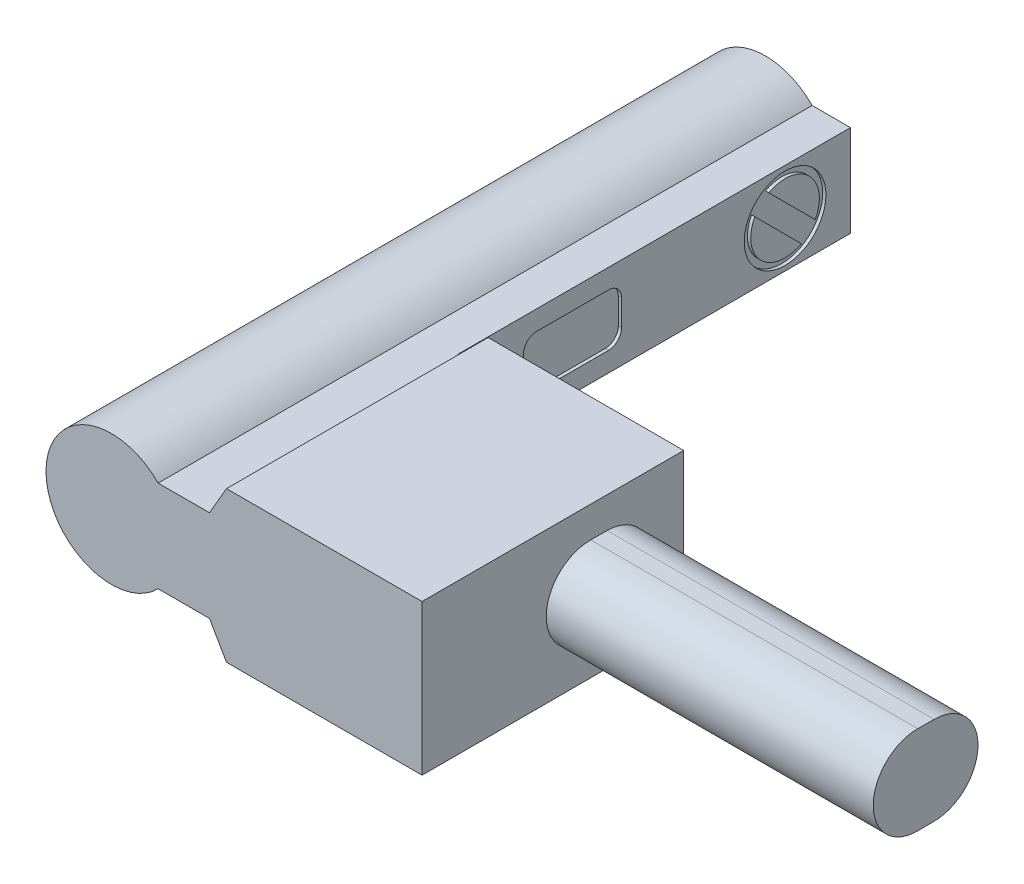
ISO-10303-21;
HEADER;
FILE_DESCRIPTION(('STEP AP214'),'2;1');
FILE_NAME('part.step','',(''),(''),'','','');
FILE_SCHEMA(('AUTOMOTIVE_DESIGN { 1 0 10303 214 1 1 1 1 }'));
ENDSEC;
DATA;
#1=APPLICATION_CONTEXT('core data for automotive mechanical design processes');
#2=APPLICATION_PROTOCOL_DEFINITION('international standard','automotive_design',2000,#1);
#3=PRODUCT_CONTEXT('',#1,'mechanical');
#4=PRODUCT('Part','Part','',(#3));
#5=PRODUCT_RELATED_PRODUCT_CATEGORY('part','',(#4));
#6=PRODUCT_DEFINITION_FORMATION('','',#4);
#7=PRODUCT_DEFINITION_CONTEXT('part definition',#1,'design');
#8=PRODUCT_DEFINITION('design','',#6,#7);
#9=PRODUCT_DEFINITION_SHAPE('','',#8);
#10=(LENGTH_UNIT() NAMED_UNIT(*) SI_UNIT(.MILLI.,.METRE.));
#11=(NAMED_UNIT(*) PLANE_ANGLE_UNIT() SI_UNIT($,.RADIAN.));
#12=(NAMED_UNIT(*) SI_UNIT($,.STERADIAN.) SOLID_ANGLE_UNIT());
#13=UNCERTAINTY_MEASURE_WITH_UNIT(LENGTH_MEASURE(1.E-05),#10,'distance_accuracy_value','');
#14=(GEOMETRIC_REPRESENTATION_CONTEXT(3) GLOBAL_UNCERTAINTY_ASSIGNED_CONTEXT((#13)) GLOBAL_UNIT_ASSIGNED_CONTEXT((#10,
#11,#12)) REPRESENTATION_CONTEXT('',''));
#15=CARTESIAN_POINT('',(0.,0.,0.));
#16=DIRECTION('',(0.,0.,1.));
#17=DIRECTION('',(1.,0.,0.));
#18=AXIS2_PLACEMENT_3D('',#15,#16,#17);
#19=CARTESIAN_POINT('',(56.6,45.4,143.));
#20=DIRECTION('',(1.,0.,0.));
#21=DIRECTION('',(0.,0.,-1.));
#22=AXIS2_PLACEMENT_3D('',#19,#20,#21);
#23=PLANE('',#22);
#24=CARTESIAN_POINT('',(56.6,44.,145.));
#25=DIRECTION('',(1.,0.,0.));
#26=DIRECTION('',(0.,0.,-1.));
#27=AXIS2_PLACEMENT_3D('',#24,#25,#26);
#28=CIRCLE('',#27,1.05);
#29=CARTESIAN_POINT('',(56.6,44.923644507894,145.499380439182));
#30=VERTEX_POINT('',#29);
#31=CARTESIAN_POINT('',(56.6,43.5006195608182,144.076355492106));
#32=VERTEX_POINT('',#31);
#33=EDGE_CURVE('E20',#30,#32,#28,.F.);
#34=ORIENTED_EDGE('',*,*,#33,.F.);
#35=DIRECTION('',(0.,0.707106781186548,0.707106781186548));
#36=VECTOR('',#35,1.);
#37=CARTESIAN_POINT('',(56.6,43.3905481980982,143.966284129386));
#38=LINE('',#37,#36);
#39=EDGE_CURVE('E150',#30,#32,#38,.F.);
#40=ORIENTED_EDGE('',*,*,#39,.T.);
#41=EDGE_LOOP('',(#34,#40));
#42=FACE_BOUND('',#41,.T.);
#43=ADVANCED_FACE('F17',(#42),#23,.T.);
#44=CARTESIAN_POINT('',(56.6,45.4,143.));
#45=DIRECTION('',(1.,0.,0.));
#46=DIRECTION('',(0.,0.,-1.));
#47=AXIS2_PLACEMENT_3D('',#44,#45,#46);
#48=PLANE('',#47);
#49=DIRECTION('',(0.,-0.707106781186548,-0.707106781186548));
#50=VECTOR('',#49,1.);
#51=CARTESIAN_POINT('',(56.6,44.6094518019018,146.033715870614));
#52=LINE('',#51,#50);
#53=CARTESIAN_POINT('',(56.6,43.0763554921061,144.500619560818));
#54=VERTEX_POINT('',#53);
#55=CARTESIAN_POINT('',(56.6,44.4993804391818,145.923644507894));
#56=VERTEX_POINT('',#55);
#57=EDGE_CURVE('E161',#54,#56,#52,.F.);
#58=ORIENTED_EDGE('',*,*,#57,.T.);
#59=CARTESIAN_POINT('',(56.6,44.,145.));
#60=DIRECTION('',(1.,0.,0.));
#61=DIRECTION('',(0.,0.,-1.));
#62=AXIS2_PLACEMENT_3D('',#59,#60,#61);
#63=CIRCLE('',#62,1.05);
#64=EDGE_CURVE('E236',#54,#56,#63,.F.);
#65=ORIENTED_EDGE('',*,*,#64,.F.);
#66=EDGE_LOOP('',(#58,#65));
#67=FACE_BOUND('',#66,.T.);
#68=ADVANCED_FACE('F765',(#67),#48,.T.);
#69=CARTESIAN_POINT('',(56.6,44.,145.));
#70=DIRECTION('',(1.,0.,0.));
#71=DIRECTION('',(0.,0.,-1.));
#72=AXIS2_PLACEMENT_3D('',#69,#70,#71);
#73=CYLINDRICAL_SURFACE('',#72,1.05);
#74=DIRECTION('',(1.,0.,0.));
#75=VECTOR('',#74,1.);
#76=CARTESIAN_POINT('',(56.6,43.5006195608181,144.076355492106));
#77=LINE('',#76,#75);
#78=CARTESIAN_POINT('',(56.5,43.5006195608181,144.076355492106));
#79=VERTEX_POINT('',#78);
#80=EDGE_CURVE('E162',#32,#79,#77,.F.);
#81=ORIENTED_EDGE('',*,*,#80,.T.);
#82=CARTESIAN_POINT('',(56.5,44.,145.));
#83=DIRECTION('',(1.,0.,0.));
#84=DIRECTION('',(0.,0.,-1.));
#85=AXIS2_PLACEMENT_3D('',#82,#83,#84);
#86=CIRCLE('',#85,1.05);
#87=CARTESIAN_POINT('',(56.5,44.9236445078939,145.499380439182));
#88=VERTEX_POINT('',#87);
#89=EDGE_CURVE('E157',#88,#79,#86,.F.);
#90=ORIENTED_EDGE('',*,*,#89,.F.);
#91=DIRECTION('',(1.,0.,0.));
#92=VECTOR('',#91,1.);
#93=CARTESIAN_POINT('',(56.6,44.923644507894,145.499380439182));
#94=LINE('',#93,#92);
#95=EDGE_CURVE('E154',#88,#30,#94,.T.);
#96=ORIENTED_EDGE('',*,*,#95,.T.);
#97=ORIENTED_EDGE('',*,*,#33,.T.);
#98=EDGE_LOOP('',(#81,#90,#96,#97));
#99=FACE_BOUND('',#98,.T.);
#100=ADVANCED_FACE('F155',(#99),#73,.T.);
#101=CARTESIAN_POINT('',(56.6,43.3905481980982,143.966284129386));
#102=DIRECTION('',(0.,0.707106781186548,-0.707106781186548));
#103=DIRECTION('',(0.,0.707106781186548,0.707106781186548));
#104=AXIS2_PLACEMENT_3D('',#101,#102,#103);
#105=PLANE('',#104);
#106=DIRECTION('',(0.,0.707106781186465,0.70710678118663));
#107=VECTOR('',#106,1.);
#108=CARTESIAN_POINT('',(56.5,43.5006195608181,144.076355492106));
#109=LINE('',#108,#107);
#110=EDGE_CURVE('E229',#79,#88,#109,.T.);
#111=ORIENTED_EDGE('',*,*,#110,.F.);
#112=ORIENTED_EDGE('',*,*,#80,.F.);
#113=ORIENTED_EDGE('',*,*,#39,.F.);
#114=ORIENTED_EDGE('',*,*,#95,.F.);
#115=EDGE_LOOP('',(#111,#112,#113,#114));
#116=FACE_BOUND('',#115,.T.);
#117=ADVANCED_FACE('F164',(#116),#105,.F.);
#118=CARTESIAN_POINT('',(56.6,44.6094518019018,146.033715870614));
#119=DIRECTION('',(0.,-0.707106781186548,0.707106781186548));
#120=DIRECTION('',(0.,-0.707106781186548,-0.707106781186548));
#121=AXIS2_PLACEMENT_3D('',#118,#119,#120);
#122=PLANE('',#121);
#123=ORIENTED_EDGE('',*,*,#57,.F.);
#124=DIRECTION('',(1.,0.,0.));
#125=VECTOR('',#124,1.);
#126=CARTESIAN_POINT('',(56.6,43.0763554921062,144.500619560818));
#127=LINE('',#126,#125);
#128=CARTESIAN_POINT('',(56.5,43.0763554921062,144.500619560818));
#129=VERTEX_POINT('',#128);
#130=EDGE_CURVE('E238',#129,#54,#127,.T.);
#131=ORIENTED_EDGE('',*,*,#130,.F.);
#132=DIRECTION('',(0.,-0.707106781186465,-0.70710678118663));
#133=VECTOR('',#132,1.);
#134=CARTESIAN_POINT('',(56.5,44.4993804391819,145.923644507894));
#135=LINE('',#134,#133);
#136=CARTESIAN_POINT('',(56.5,44.4993804391818,145.923644507894));
#137=VERTEX_POINT('',#136);
#138=EDGE_CURVE('E227',#137,#129,#135,.T.);
#139=ORIENTED_EDGE('',*,*,#138,.F.);
#140=DIRECTION('',(1.,0.,0.));
#141=VECTOR('',#140,1.);
#142=CARTESIAN_POINT('',(56.6,44.4993804391819,145.923644507894));
#143=LINE('',#142,#141);
#144=EDGE_CURVE('E235',#56,#137,#143,.F.);
#145=ORIENTED_EDGE('',*,*,#144,.F.);
#146=EDGE_LOOP('',(#123,#131,#139,#145));
#147=FACE_BOUND('',#146,.T.);
#148=ADVANCED_FACE('F742',(#147),#122,.F.);
#149=CARTESIAN_POINT('',(56.6,44.,145.));
#150=DIRECTION('',(1.,0.,0.));
#151=DIRECTION('',(0.,0.,-1.));
#152=AXIS2_PLACEMENT_3D('',#149,#150,#151);
#153=CYLINDRICAL_SURFACE('',#152,1.05);
#154=ORIENTED_EDGE('',*,*,#144,.T.);
#155=CARTESIAN_POINT('',(56.5,44.,145.));
#156=DIRECTION('',(1.,0.,0.));
#157=DIRECTION('',(0.,0.,-1.));
#158=AXIS2_PLACEMENT_3D('',#155,#156,#157);
#159=CIRCLE('',#158,1.05);
#160=EDGE_CURVE('E223',#129,#137,#159,.F.);
#161=ORIENTED_EDGE('',*,*,#160,.F.);
#162=ORIENTED_EDGE('',*,*,#130,.T.);
#163=ORIENTED_EDGE('',*,*,#64,.T.);
#164=EDGE_LOOP('',(#154,#161,#162,#163));
#165=FACE_BOUND('',#164,.T.);
#166=ADVANCED_FACE('F733',(#165),#153,.T.);
#167=CARTESIAN_POINT('',(56.5,44.,143.));
#168=DIRECTION('',(1.,0.,0.));
#169=DIRECTION('',(0.,0.,-1.));
#170=AXIS2_PLACEMENT_3D('',#167,#168,#169);
#171=PLANE('',#170);
#172=DIRECTION('',(0.,1.,0.));
#173=VECTOR('',#172,1.);
#174=CARTESIAN_POINT('',(56.5,43.6,150.));
#175=LINE('',#174,#173);
#176=CARTESIAN_POINT('',(56.5,43.6,150.));
#177=VERTEX_POINT('',#176);
#178=CARTESIAN_POINT('',(56.5,44.4,150.));
#179=VERTEX_POINT('',#178);
#180=EDGE_CURVE('E252',#177,#179,#175,.T.);
#181=ORIENTED_EDGE('',*,*,#180,.T.);
#182=CARTESIAN_POINT('',(56.5,44.4,150.4));
#183=DIRECTION('',(1.,0.,0.));
#184=DIRECTION('',(0.,0.,-1.));
#185=AXIS2_PLACEMENT_3D('',#182,#183,#184);
#186=CIRCLE('',#185,0.4);
#187=CARTESIAN_POINT('',(56.5,44.8,150.4));
#188=VERTEX_POINT('',#187);
#189=EDGE_CURVE('E218',#179,#188,#186,.T.);
#190=ORIENTED_EDGE('',*,*,#189,.T.);
#191=DIRECTION('',(0.,0.,1.));
#192=VECTOR('',#191,1.);
#193=CARTESIAN_POINT('',(56.5,44.8,150.4));
#194=LINE('',#193,#192);
#195=CARTESIAN_POINT('',(56.5,44.8,152.6));
#196=VERTEX_POINT('',#195);
#197=EDGE_CURVE('E261',#188,#196,#194,.T.);
#198=ORIENTED_EDGE('',*,*,#197,.T.);
#199=CARTESIAN_POINT('',(56.5,44.4,152.6));
#200=DIRECTION('',(1.,0.,0.));
#201=DIRECTION('',(0.,0.,-1.));
#202=AXIS2_PLACEMENT_3D('',#199,#200,#201);
#203=CIRCLE('',#202,0.4);
#204=CARTESIAN_POINT('',(56.5,44.4,153.));
#205=VERTEX_POINT('',#204);
#206=EDGE_CURVE('E233',#196,#205,#203,.T.);
#207=ORIENTED_EDGE('',*,*,#206,.T.);
#208=DIRECTION('',(0.,1.,0.));
#209=VECTOR('',#208,1.);
#210=CARTESIAN_POINT('',(56.5,44.,153.));
#211=LINE('',#210,#209);
#212=CARTESIAN_POINT('',(56.5,43.6,153.));
#213=VERTEX_POINT('',#212);
#214=EDGE_CURVE('E232',#205,#213,#211,.F.);
#215=ORIENTED_EDGE('',*,*,#214,.T.);
#216=CARTESIAN_POINT('',(56.5,43.6,152.6));
#217=DIRECTION('',(1.,0.,0.));
#218=DIRECTION('',(0.,0.,-1.));
#219=AXIS2_PLACEMENT_3D('',#216,#217,#218);
#220=CIRCLE('',#219,0.4);
#221=CARTESIAN_POINT('',(56.5,43.2,152.6));
#222=VERTEX_POINT('',#221);
#223=EDGE_CURVE('E230',#213,#222,#220,.T.);
#224=ORIENTED_EDGE('',*,*,#223,.T.);
#225=DIRECTION('',(0.,0.,-1.));
#226=VECTOR('',#225,1.);
#227=CARTESIAN_POINT('',(56.5,43.2,152.6));
#228=LINE('',#227,#226);
#229=CARTESIAN_POINT('',(56.5,43.2,150.4));
#230=VERTEX_POINT('',#229);
#231=EDGE_CURVE('E257',#222,#230,#228,.T.);
#232=ORIENTED_EDGE('',*,*,#231,.T.);
#233=CARTESIAN_POINT('',(56.5,43.6,150.4));
#234=DIRECTION('',(1.,0.,0.));
#235=DIRECTION('',(0.,0.,-1.));
#236=AXIS2_PLACEMENT_3D('',#233,#234,#235);
#237=CIRCLE('',#236,0.4);
#238=EDGE_CURVE('E213',#230,#177,#237,.T.);
#239=ORIENTED_EDGE('',*,*,#238,.T.);
#240=EDGE_LOOP('',(#181,#190,#198,#207,#215,#224,#232,#239));
#241=FACE_BOUND('',#240,.T.);
#242=ADVANCED_FACE('F724',(#241),#171,.T.);
#243=CARTESIAN_POINT('',(56.5,44.,143.));
#244=DIRECTION('',(1.,0.,0.));
#245=DIRECTION('',(0.,0.,-1.));
#246=AXIS2_PLACEMENT_3D('',#243,#244,#245);
#247=PLANE('',#246);
#248=CARTESIAN_POINT('',(56.5,44.,145.));
#249=DIRECTION('',(1.,0.,0.));
#250=DIRECTION('',(0.,0.,-1.));
#251=AXIS2_PLACEMENT_3D('',#248,#249,#250);
#252=CIRCLE('',#251,1.25);
#253=CARTESIAN_POINT('',(56.5,44.,143.75));
#254=VERTEX_POINT('',#253);
#255=EDGE_CURVE('E209',#254,#254,#252,.T.);
#256=ORIENTED_EDGE('',*,*,#255,.T.);
#257=EDGE_LOOP('',(#256));
#258=FACE_BOUND('',#257,.T.);
#259=ORIENTED_EDGE('',*,*,#138,.T.);
#260=ORIENTED_EDGE('',*,*,#160,.T.);
#261=EDGE_LOOP('',(#259,#260));
#262=FACE_BOUND('',#261,.T.);
#263=ORIENTED_EDGE('',*,*,#89,.T.);
#264=ORIENTED_EDGE('',*,*,#110,.T.);
#265=EDGE_LOOP('',(#263,#264));
#266=FACE_BOUND('',#265,.T.);
#267=ADVANCED_FACE('F715',(#258,#262,#266),#247,.T.);
#268=CARTESIAN_POINT('',(73.5,44.,143.));
#269=DIRECTION('',(1.,0.,0.));
#270=DIRECTION('',(0.,0.,-1.));
#271=AXIS2_PLACEMENT_3D('',#268,#269,#270);
#272=PLANE('',#271);
#273=CARTESIAN_POINT('',(73.5,44.,157.85));
#274=DIRECTION('',(-1.,0.,0.));
#275=DIRECTION('',(0.,0.,1.));
#276=AXIS2_PLACEMENT_3D('',#273,#274,#275);
#277=CIRCLE('',#276,1.353);
#278=CARTESIAN_POINT('',(73.5,42.6470243542192,157.841882));
#279=VERTEX_POINT('',#278);
#280=CARTESIAN_POINT('',(73.5,45.3529756457808,157.841882));
#281=VERTEX_POINT('',#280);
#282=EDGE_CURVE('E205',#279,#281,#277,.T.);
#283=ORIENTED_EDGE('',*,*,#282,.F.);
#284=DIRECTION('',(0.,0.00599999999999964,-0.999981999837997));
#285=VECTOR('',#284,1.);
#286=CARTESIAN_POINT('',(73.5,42.6500243002187,157.3419));
#287=LINE('',#286,#285);
#288=CARTESIAN_POINT('',(73.5,42.6500243002187,157.3419));
#289=VERTEX_POINT('',#288);
#290=EDGE_CURVE('E226',#289,#279,#287,.F.);
#291=ORIENTED_EDGE('',*,*,#290,.F.);
#292=CARTESIAN_POINT('',(73.5,44.,157.35));
#293=DIRECTION('',(-1.,0.,0.));
#294=DIRECTION('',(0.,0.,1.));
#295=AXIS2_PLACEMENT_3D('',#292,#293,#294);
#296=CIRCLE('',#295,1.35);
#297=CARTESIAN_POINT('',(73.5,45.3499756997813,157.3419));
#298=VERTEX_POINT('',#297);
#299=EDGE_CURVE('E200',#298,#289,#296,.T.);
#300=ORIENTED_EDGE('',*,*,#299,.F.);
#301=DIRECTION('',(0.,0.00599999999999964,0.999981999837997));
#302=VECTOR('',#301,1.);
#303=CARTESIAN_POINT('',(73.5,45.3529756457808,157.841882));
#304=LINE('',#303,#302);
#305=EDGE_CURVE('E278',#281,#298,#304,.F.);
#306=ORIENTED_EDGE('',*,*,#305,.F.);
#307=EDGE_LOOP('',(#283,#291,#300,#306));
#308=FACE_BOUND('',#307,.T.);
#309=ADVANCED_FACE('F706',(#308),#272,.T.);
#310=CARTESIAN_POINT('',(63.5,42.6500243002187,157.3419));
#311=DIRECTION('',(0.,-0.999981999837997,-0.00599999999999964));
#312=DIRECTION('',(0.,0.00599999999999964,-0.999981999837997));
#313=AXIS2_PLACEMENT_3D('',#310,#311,#312);
#314=PLANE('',#313);
#315=DIRECTION('',(0.,0.00599999999999964,-0.999981999837997));
#316=VECTOR('',#315,1.);
#317=CARTESIAN_POINT('',(63.5,42.6500243002187,157.3419));
#318=LINE('',#317,#316);
#319=CARTESIAN_POINT('',(63.5,42.6470243542192,157.841882));
#320=VERTEX_POINT('',#319);
#321=CARTESIAN_POINT('',(63.5,42.6500243002187,157.3419));
#322=VERTEX_POINT('',#321);
#323=EDGE_CURVE('E251',#320,#322,#318,.T.);
#324=ORIENTED_EDGE('',*,*,#323,.T.);
#325=DIRECTION('',(-1.,0.,0.));
#326=VECTOR('',#325,1.);
#327=CARTESIAN_POINT('',(63.5,42.6500243002187,157.3419));
#328=LINE('',#327,#326);
#329=EDGE_CURVE('E203',#289,#322,#328,.T.);
#330=ORIENTED_EDGE('',*,*,#329,.F.);
#331=ORIENTED_EDGE('',*,*,#290,.T.);
#332=DIRECTION('',(1.,0.,0.));
#333=VECTOR('',#332,1.);
#334=CARTESIAN_POINT('',(63.5,42.6470243542192,157.841882));
#335=LINE('',#334,#333);
#336=EDGE_CURVE('E248',#279,#320,#335,.F.);
#337=ORIENTED_EDGE('',*,*,#336,.T.);
#338=EDGE_LOOP('',(#324,#330,#331,#337));
#339=FACE_BOUND('',#338,.T.);
#340=ADVANCED_FACE('F697',(#339),#314,.T.);
#341=CARTESIAN_POINT('',(63.5,45.3529756457808,157.841882));
#342=DIRECTION('',(0.,0.999981999837997,-0.00599999999999964));
#343=DIRECTION('',(0.,0.00599999999999964,0.999981999837997));
#344=AXIS2_PLACEMENT_3D('',#341,#342,#343);
#345=PLANE('',#344);
#346=DIRECTION('',(0.,0.00599999999999964,0.999981999837997));
#347=VECTOR('',#346,1.);
#348=CARTESIAN_POINT('',(63.5,45.3529756457808,157.841882));
#349=LINE('',#348,#347);
#350=CARTESIAN_POINT('',(63.5,45.3499756997813,157.3419));
#351=VERTEX_POINT('',#350);
#352=CARTESIAN_POINT('',(63.5,45.3529756457808,157.841882));
#353=VERTEX_POINT('',#352);
#354=EDGE_CURVE('E264',#351,#353,#349,.T.);
#355=ORIENTED_EDGE('',*,*,#354,.T.);
#356=DIRECTION('',(-1.,0.,0.));
#357=VECTOR('',#356,1.);
#358=CARTESIAN_POINT('',(63.5,45.3529756457808,157.841882));
#359=LINE('',#358,#357);
#360=EDGE_CURVE('E204',#281,#353,#359,.T.);
#361=ORIENTED_EDGE('',*,*,#360,.F.);
#362=ORIENTED_EDGE('',*,*,#305,.T.);
#363=DIRECTION('',(-1.,0.,0.));
#364=VECTOR('',#363,1.);
#365=CARTESIAN_POINT('',(63.5,45.3499756997813,157.3419));
#366=LINE('',#365,#364);
#367=EDGE_CURVE('E341',#351,#298,#366,.F.);
#368=ORIENTED_EDGE('',*,*,#367,.F.);
#369=EDGE_LOOP('',(#355,#361,#362,#368));
#370=FACE_BOUND('',#369,.T.);
#371=ADVANCED_FACE('F688',(#370),#345,.T.);
#372=CARTESIAN_POINT('',(56.6,44.8,150.4));
#373=DIRECTION('',(0.,1.,0.));
#374=DIRECTION('',(0.,0.,1.));
#375=AXIS2_PLACEMENT_3D('',#372,#373,#374);
#376=PLANE('',#375);
#377=DIRECTION('',(1.,0.,0.));
#378=VECTOR('',#377,1.);
#379=CARTESIAN_POINT('',(56.6,44.8,150.4));
#380=LINE('',#379,#378);
#381=CARTESIAN_POINT('',(56.6,44.8,150.4));
#382=VERTEX_POINT('',#381);
#383=EDGE_CURVE('E222',#188,#382,#380,.T.);
#384=ORIENTED_EDGE('',*,*,#383,.T.);
#385=DIRECTION('',(0.,0.,-1.));
#386=VECTOR('',#385,1.);
#387=CARTESIAN_POINT('',(56.6,44.8,143.));
#388=LINE('',#387,#386);
#389=CARTESIAN_POINT('',(56.6,44.8,152.6));
#390=VERTEX_POINT('',#389);
#391=EDGE_CURVE('E199',#390,#382,#388,.T.);
#392=ORIENTED_EDGE('',*,*,#391,.F.);
#393=DIRECTION('',(1.,0.,0.));
#394=VECTOR('',#393,1.);
#395=CARTESIAN_POINT('',(56.6,44.8,152.6));
#396=LINE('',#395,#394);
#397=EDGE_CURVE('E212',#390,#196,#396,.F.);
#398=ORIENTED_EDGE('',*,*,#397,.T.);
#399=ORIENTED_EDGE('',*,*,#197,.F.);
#400=EDGE_LOOP('',(#384,#392,#398,#399));
#401=FACE_BOUND('',#400,.T.);
#402=ADVANCED_FACE('F679',(#401),#376,.F.);
#403=CARTESIAN_POINT('',(56.6,44.4,150.4));
#404=DIRECTION('',(1.,0.,0.));
#405=DIRECTION('',(0.,0.,-1.));
#406=AXIS2_PLACEMENT_3D('',#403,#404,#405);
#407=CYLINDRICAL_SURFACE('',#406,0.4);
#408=DIRECTION('',(-1.,0.,0.));
#409=VECTOR('',#408,1.);
#410=CARTESIAN_POINT('',(56.6,44.4,150.));
#411=LINE('',#410,#409);
#412=CARTESIAN_POINT('',(56.6,44.4,150.));
#413=VERTEX_POINT('',#412);
#414=EDGE_CURVE('E221',#179,#413,#411,.F.);
#415=ORIENTED_EDGE('',*,*,#414,.T.);
#416=CARTESIAN_POINT('',(56.6,44.4,150.4));
#417=DIRECTION('',(1.,0.,0.));
#418=DIRECTION('',(0.,0.,-1.));
#419=AXIS2_PLACEMENT_3D('',#416,#417,#418);
#420=CIRCLE('',#419,0.4);
#421=EDGE_CURVE('E196',#382,#413,#420,.F.);
#422=ORIENTED_EDGE('',*,*,#421,.F.);
#423=ORIENTED_EDGE('',*,*,#383,.F.);
#424=ORIENTED_EDGE('',*,*,#189,.F.);
#425=EDGE_LOOP('',(#415,#422,#423,#424));
#426=FACE_BOUND('',#425,.T.);
#427=ADVANCED_FACE('F670',(#426),#407,.F.);
#428=CARTESIAN_POINT('',(56.6,43.6,150.));
#429=DIRECTION('',(0.,0.,-1.));
#430=DIRECTION('',(-1.,0.,0.));
#431=AXIS2_PLACEMENT_3D('',#428,#429,#430);
#432=PLANE('',#431);
#433=DIRECTION('',(1.,0.,0.));
#434=VECTOR('',#433,1.);
#435=CARTESIAN_POINT('',(56.6,43.6,150.));
#436=LINE('',#435,#434);
#437=CARTESIAN_POINT('',(56.6,43.6,150.));
#438=VERTEX_POINT('',#437);
#439=EDGE_CURVE('E217',#177,#438,#436,.T.);
#440=ORIENTED_EDGE('',*,*,#439,.T.);
#441=DIRECTION('',(0.,1.,0.));
#442=VECTOR('',#441,1.);
#443=CARTESIAN_POINT('',(56.6,45.4,150.));
#444=LINE('',#443,#442);
#445=EDGE_CURVE('E195',#413,#438,#444,.F.);
#446=ORIENTED_EDGE('',*,*,#445,.F.);
#447=ORIENTED_EDGE('',*,*,#414,.F.);
#448=ORIENTED_EDGE('',*,*,#180,.F.);
#449=EDGE_LOOP('',(#440,#446,#447,#448));
#450=FACE_BOUND('',#449,.T.);
#451=ADVANCED_FACE('F661',(#450),#432,.F.);
#452=CARTESIAN_POINT('',(56.6,43.6,150.4));
#453=DIRECTION('',(1.,0.,0.));
#454=DIRECTION('',(0.,0.,-1.));
#455=AXIS2_PLACEMENT_3D('',#452,#453,#454);
#456=CYLINDRICAL_SURFACE('',#455,0.4);
#457=DIRECTION('',(1.,0.,0.));
#458=VECTOR('',#457,1.);
#459=CARTESIAN_POINT('',(56.6,43.2,150.4));
#460=LINE('',#459,#458);
#461=CARTESIAN_POINT('',(56.6,43.2,150.4));
#462=VERTEX_POINT('',#461);
#463=EDGE_CURVE('E216',#230,#462,#460,.T.);
#464=ORIENTED_EDGE('',*,*,#463,.T.);
#465=CARTESIAN_POINT('',(56.6,43.6,150.4));
#466=DIRECTION('',(1.,0.,0.));
#467=DIRECTION('',(0.,0.,-1.));
#468=AXIS2_PLACEMENT_3D('',#465,#466,#467);
#469=CIRCLE('',#468,0.4);
#470=EDGE_CURVE('E192',#438,#462,#469,.F.);
#471=ORIENTED_EDGE('',*,*,#470,.F.);
#472=ORIENTED_EDGE('',*,*,#439,.F.);
#473=ORIENTED_EDGE('',*,*,#238,.F.);
#474=EDGE_LOOP('',(#464,#471,#472,#473));
#475=FACE_BOUND('',#474,.T.);
#476=ADVANCED_FACE('F652',(#475),#456,.F.);
#477=CARTESIAN_POINT('',(56.6,43.2,152.6));
#478=DIRECTION('',(0.,-1.,0.));
#479=DIRECTION('',(0.,0.,-1.));
#480=AXIS2_PLACEMENT_3D('',#477,#478,#479);
#481=PLANE('',#480);
#482=DIRECTION('',(1.,0.,0.));
#483=VECTOR('',#482,1.);
#484=CARTESIAN_POINT('',(56.6,43.2,152.6));
#485=LINE('',#484,#483);
#486=CARTESIAN_POINT('',(56.6,43.2,152.6));
#487=VERTEX_POINT('',#486);
#488=EDGE_CURVE('E260',#222,#487,#485,.T.);
#489=ORIENTED_EDGE('',*,*,#488,.T.);
#490=DIRECTION('',(0.,0.,-1.));
#491=VECTOR('',#490,1.);
#492=CARTESIAN_POINT('',(56.6,43.2,143.));
#493=LINE('',#492,#491);
#494=EDGE_CURVE('E191',#462,#487,#493,.F.);
#495=ORIENTED_EDGE('',*,*,#494,.F.);
#496=ORIENTED_EDGE('',*,*,#463,.F.);
#497=ORIENTED_EDGE('',*,*,#231,.F.);
#498=EDGE_LOOP('',(#489,#495,#496,#497));
#499=FACE_BOUND('',#498,.T.);
#500=ADVANCED_FACE('F643',(#499),#481,.F.);
#501=CARTESIAN_POINT('',(56.6,43.6,152.6));
#502=DIRECTION('',(1.,0.,0.));
#503=DIRECTION('',(0.,0.,-1.));
#504=AXIS2_PLACEMENT_3D('',#501,#502,#503);
#505=CYLINDRICAL_SURFACE('',#504,0.4);
#506=DIRECTION('',(1.,0.,0.));
#507=VECTOR('',#506,1.);
#508=CARTESIAN_POINT('',(56.6,43.6,153.));
#509=LINE('',#508,#507);
#510=CARTESIAN_POINT('',(56.6,43.6,153.));
#511=VERTEX_POINT('',#510);
#512=EDGE_CURVE('E314',#213,#511,#509,.T.);
#513=ORIENTED_EDGE('',*,*,#512,.T.);
#514=CARTESIAN_POINT('',(56.6,43.6,152.6));
#515=DIRECTION('',(1.,0.,0.));
#516=DIRECTION('',(0.,0.,-1.));
#517=AXIS2_PLACEMENT_3D('',#514,#515,#516);
#518=CIRCLE('',#517,0.4);
#519=EDGE_CURVE('E188',#487,#511,#518,.F.);
#520=ORIENTED_EDGE('',*,*,#519,.F.);
#521=ORIENTED_EDGE('',*,*,#488,.F.);
#522=ORIENTED_EDGE('',*,*,#223,.F.);
#523=EDGE_LOOP('',(#513,#520,#521,#522));
#524=FACE_BOUND('',#523,.T.);
#525=ADVANCED_FACE('F634',(#524),#505,.F.);
#526=CARTESIAN_POINT('',(56.6,44.4,153.));
#527=DIRECTION('',(0.,0.,1.));
#528=DIRECTION('',(1.,0.,0.));
#529=AXIS2_PLACEMENT_3D('',#526,#527,#528);
#530=PLANE('',#529);
#531=DIRECTION('',(1.,0.,0.));
#532=VECTOR('',#531,1.);
#533=CARTESIAN_POINT('',(56.6,44.4,153.));
#534=LINE('',#533,#532);
#535=CARTESIAN_POINT('',(56.6,44.4,153.));
#536=VERTEX_POINT('',#535);
#537=EDGE_CURVE('E316',#205,#536,#534,.T.);
#538=ORIENTED_EDGE('',*,*,#537,.T.);
#539=DIRECTION('',(0.,1.,0.));
#540=VECTOR('',#539,1.);
#541=CARTESIAN_POINT('',(56.6,45.4,153.));
#542=LINE('',#541,#540);
#543=EDGE_CURVE('E187',#511,#536,#542,.T.);
#544=ORIENTED_EDGE('',*,*,#543,.F.);
#545=ORIENTED_EDGE('',*,*,#512,.F.);
#546=ORIENTED_EDGE('',*,*,#214,.F.);
#547=EDGE_LOOP('',(#538,#544,#545,#546));
#548=FACE_BOUND('',#547,.T.);
#549=ADVANCED_FACE('F625',(#548),#530,.F.);
#550=CARTESIAN_POINT('',(56.6,44.4,152.6));
#551=DIRECTION('',(1.,0.,0.));
#552=DIRECTION('',(0.,0.,-1.));
#553=AXIS2_PLACEMENT_3D('',#550,#551,#552);
#554=CYLINDRICAL_SURFACE('',#553,0.4);
#555=ORIENTED_EDGE('',*,*,#397,.F.);
#556=CARTESIAN_POINT('',(56.6,44.4,152.6));
#557=DIRECTION('',(1.,0.,0.));
#558=DIRECTION('',(0.,0.,-1.));
#559=AXIS2_PLACEMENT_3D('',#556,#557,#558);
#560=CIRCLE('',#559,0.4);
#561=EDGE_CURVE('E184',#536,#390,#560,.F.);
#562=ORIENTED_EDGE('',*,*,#561,.F.);
#563=ORIENTED_EDGE('',*,*,#537,.F.);
#564=ORIENTED_EDGE('',*,*,#206,.F.);
#565=EDGE_LOOP('',(#555,#562,#563,#564));
#566=FACE_BOUND('',#565,.T.);
#567=ADVANCED_FACE('F616',(#566),#554,.F.);
#568=CARTESIAN_POINT('',(56.6,44.,145.));
#569=DIRECTION('',(1.,0.,0.));
#570=DIRECTION('',(0.,0.,-1.));
#571=AXIS2_PLACEMENT_3D('',#568,#569,#570);
#572=CYLINDRICAL_SURFACE('',#571,1.25);
#573=CARTESIAN_POINT('',(56.6,44.,145.));
#574=DIRECTION('',(1.,0.,0.));
#575=DIRECTION('',(0.,0.,-1.));
#576=AXIS2_PLACEMENT_3D('',#573,#574,#575);
#577=CIRCLE('',#576,1.25);
#578=CARTESIAN_POINT('',(56.6,44.,143.75));
#579=VERTEX_POINT('',#578);
#580=EDGE_CURVE('E180',#579,#579,#577,.F.);
#581=ORIENTED_EDGE('',*,*,#580,.F.);
#582=EDGE_LOOP('',(#581));
#583=FACE_BOUND('',#582,.T.);
#584=ORIENTED_EDGE('',*,*,#255,.F.);
#585=EDGE_LOOP('',(#584));
#586=FACE_BOUND('',#585,.T.);
#587=ADVANCED_FACE('F608',(#583,#586),#572,.F.);
#588=CARTESIAN_POINT('',(57.5196152422707,46.3,163.));
#589=DIRECTION('',(-0.866025403784439,0.5,0.));
#590=DIRECTION('',(-0.5,-0.866025403784439,0.));
#591=AXIS2_PLACEMENT_3D('',#588,#589,#590);
#592=PLANE('',#591);
#593=DIRECTION('',(-0.5,-0.866025403784439,0.));
#594=VECTOR('',#593,1.);
#595=CARTESIAN_POINT('',(57.5196152422707,46.3,163.));
#596=LINE('',#595,#594);
#597=CARTESIAN_POINT('',(57.,45.4,163.));
#598=VERTEX_POINT('',#597);
#599=CARTESIAN_POINT('',(57.5196152422707,46.3,163.));
#600=VERTEX_POINT('',#599);
#601=EDGE_CURVE('E208',#598,#600,#596,.F.);
#602=ORIENTED_EDGE('',*,*,#601,.T.);
#603=DIRECTION('',(0.,0.,1.));
#604=VECTOR('',#603,1.);
#605=CARTESIAN_POINT('',(57.5196152422707,46.3,163.));
#606=LINE('',#605,#604);
#607=CARTESIAN_POINT('',(57.5196152422707,46.3,155.));
#608=VERTEX_POINT('',#607);
#609=EDGE_CURVE('E179',#608,#600,#606,.T.);
#610=ORIENTED_EDGE('',*,*,#609,.F.);
#611=DIRECTION('',(0.500000000000031,0.866025403784421,0.));
#612=VECTOR('',#611,1.);
#613=CARTESIAN_POINT('',(57.,45.4,155.));
#614=LINE('',#613,#612);
#615=CARTESIAN_POINT('',(57.,45.4,155.));
#616=VERTEX_POINT('',#615);
#617=EDGE_CURVE('E305',#616,#608,#614,.T.);
#618=ORIENTED_EDGE('',*,*,#617,.F.);
#619=DIRECTION('',(0.,0.,1.));
#620=VECTOR('',#619,1.);
#621=CARTESIAN_POINT('',(57.,45.4,143.));
#622=LINE('',#621,#620);
#623=EDGE_CURVE('E298',#598,#616,#622,.F.);
#624=ORIENTED_EDGE('',*,*,#623,.F.);
#625=EDGE_LOOP('',(#602,#610,#618,#624));
#626=FACE_BOUND('',#625,.T.);
#627=ADVANCED_FACE('F490',(#626),#592,.T.);
#628=CARTESIAN_POINT('',(63.5,44.,157.85));
#629=DIRECTION('',(-1.,0.,0.));
#630=DIRECTION('',(0.,0.,1.));
#631=AXIS2_PLACEMENT_3D('',#628,#629,#630);
#632=CYLINDRICAL_SURFACE('',#631,1.353);
#633=ORIENTED_EDGE('',*,*,#360,.T.);
#634=CARTESIAN_POINT('',(63.5,44.,157.85));
#635=DIRECTION('',(-1.,0.,0.));
#636=DIRECTION('',(0.,0.,1.));
#637=AXIS2_PLACEMENT_3D('',#634,#635,#636);
#638=CIRCLE('',#637,1.353);
#639=EDGE_CURVE('E176',#320,#353,#638,.T.);
#640=ORIENTED_EDGE('',*,*,#639,.F.);
#641=ORIENTED_EDGE('',*,*,#336,.F.);
#642=ORIENTED_EDGE('',*,*,#282,.T.);
#643=EDGE_LOOP('',(#633,#640,#641,#642));
#644=FACE_BOUND('',#643,.T.);
#645=ADVANCED_FACE('F591',(#644),#632,.T.);
#646=CARTESIAN_POINT('',(63.5,44.,157.35));
#647=DIRECTION('',(-1.,0.,0.));
#648=DIRECTION('',(0.,0.,1.));
#649=AXIS2_PLACEMENT_3D('',#646,#647,#648);
#650=CYLINDRICAL_SURFACE('',#649,1.35);
#651=CARTESIAN_POINT('',(63.5,44.,157.35));
#652=DIRECTION('',(-1.,0.,0.));
#653=DIRECTION('',(0.,0.,1.));
#654=AXIS2_PLACEMENT_3D('',#651,#652,#653);
#655=CIRCLE('',#654,1.35);
#656=EDGE_CURVE('E172',#351,#322,#655,.T.);
#657=ORIENTED_EDGE('',*,*,#656,.F.);
#658=ORIENTED_EDGE('',*,*,#367,.T.);
#659=ORIENTED_EDGE('',*,*,#299,.T.);
#660=ORIENTED_EDGE('',*,*,#329,.T.);
#661=EDGE_LOOP('',(#657,#658,#659,#660));
#662=FACE_BOUND('',#661,.T.);
#663=ADVANCED_FACE('F583',(#662),#650,.T.);
#664=CARTESIAN_POINT('',(54.,44.,155.));
#665=DIRECTION('',(0.,0.,-1.));
#666=DIRECTION('',(-1.,0.,0.));
#667=AXIS2_PLACEMENT_3D('',#664,#665,#666);
#668=PLANE('',#667);
#669=DIRECTION('',(1.,0.,0.));
#670=VECTOR('',#669,1.);
#671=CARTESIAN_POINT('',(57.5196152422707,41.7,155.));
#672=LINE('',#671,#670);
#673=CARTESIAN_POINT('',(57.5196152422707,41.7,155.));
#674=VERTEX_POINT('',#673);
#675=CARTESIAN_POINT('',(63.5,41.7,155.));
#676=VERTEX_POINT('',#675);
#677=EDGE_CURVE('E332',#674,#676,#672,.T.);
#678=ORIENTED_EDGE('',*,*,#677,.F.);
#679=DIRECTION('',(0.5,-0.866025403784439,0.));
#680=VECTOR('',#679,1.);
#681=CARTESIAN_POINT('',(57.,42.6,155.));
#682=LINE('',#681,#680);
#683=CARTESIAN_POINT('',(57.,42.6,155.));
#684=VERTEX_POINT('',#683);
#685=EDGE_CURVE('E371',#684,#674,#682,.T.);
#686=ORIENTED_EDGE('',*,*,#685,.F.);
#687=DIRECTION('',(-1.,0.,0.));
#688=VECTOR('',#687,1.);
#689=CARTESIAN_POINT('',(54.,42.6,155.));
#690=LINE('',#689,#688);
#691=CARTESIAN_POINT('',(56.6,42.6,155.));
#692=VERTEX_POINT('',#691);
#693=EDGE_CURVE('E308',#684,#692,#690,.T.);
#694=ORIENTED_EDGE('',*,*,#693,.T.);
#695=DIRECTION('',(0.,1.,0.));
#696=VECTOR('',#695,1.);
#697=CARTESIAN_POINT('',(56.6,45.4,155.));
#698=LINE('',#697,#696);
#699=CARTESIAN_POINT('',(56.6,45.4,155.));
#700=VERTEX_POINT('',#699);
#701=EDGE_CURVE('E183',#700,#692,#698,.F.);
#702=ORIENTED_EDGE('',*,*,#701,.F.);
#703=DIRECTION('',(1.,0.,0.));
#704=VECTOR('',#703,1.);
#705=CARTESIAN_POINT('',(55.4282856857086,45.4,155.));
#706=LINE('',#705,#704);
#707=EDGE_CURVE('E301',#616,#700,#706,.F.);
#708=ORIENTED_EDGE('',*,*,#707,.F.);
#709=ORIENTED_EDGE('',*,*,#617,.T.);
#710=DIRECTION('',(-1.,0.,0.));
#711=VECTOR('',#710,1.);
#712=CARTESIAN_POINT('',(63.5,46.3,155.));
#713=LINE('',#712,#711);
#714=CARTESIAN_POINT('',(63.5,46.3,155.));
#715=VERTEX_POINT('',#714);
#716=EDGE_CURVE('E284',#715,#608,#713,.T.);
#717=ORIENTED_EDGE('',*,*,#716,.F.);
#718=DIRECTION('',(0.,1.,0.));
#719=VECTOR('',#718,1.);
#720=CARTESIAN_POINT('',(63.5,41.7,155.));
#721=LINE('',#720,#719);
#722=EDGE_CURVE('E175',#676,#715,#721,.T.);
#723=ORIENTED_EDGE('',*,*,#722,.F.);
#724=EDGE_LOOP('',(#678,#686,#694,#702,#708,#709,#717,#723));
#725=FACE_BOUND('',#724,.T.);
#726=ADVANCED_FACE('F489',(#725),#668,.T.);
#727=CARTESIAN_POINT('',(55.4282856857086,45.4,143.));
#728=DIRECTION('',(0.,1.,0.));
#729=DIRECTION('',(0.,0.,1.));
#730=AXIS2_PLACEMENT_3D('',#727,#728,#729);
#731=PLANE('',#730);
#732=DIRECTION('',(1.,0.,0.));
#733=VECTOR('',#732,1.);
#734=CARTESIAN_POINT('',(55.4282856857086,45.4,143.));
#735=LINE('',#734,#733);
#736=CARTESIAN_POINT('',(56.6,45.4,143.));
#737=VERTEX_POINT('',#736);
#738=CARTESIAN_POINT('',(55.4282856857086,45.4,143.));
#739=VERTEX_POINT('',#738);
#740=EDGE_CURVE('E329',#737,#739,#735,.F.);
#741=ORIENTED_EDGE('',*,*,#740,.T.);
#742=DIRECTION('',(0.,0.,-1.));
#743=VECTOR('',#742,1.);
#744=CARTESIAN_POINT('',(55.4282856857086,45.4,143.));
#745=LINE('',#744,#743);
#746=CARTESIAN_POINT('',(55.4282856857086,45.4,163.));
#747=VERTEX_POINT('',#746);
#748=EDGE_CURVE('E352',#747,#739,#745,.T.);
#749=ORIENTED_EDGE('',*,*,#748,.F.);
#750=DIRECTION('',(1.,0.,0.));
#751=VECTOR('',#750,1.);
#752=CARTESIAN_POINT('',(55.4282856857086,45.4,163.));
#753=LINE('',#752,#751);
#754=EDGE_CURVE('E302',#747,#598,#753,.T.);
#755=ORIENTED_EDGE('',*,*,#754,.T.);
#756=ORIENTED_EDGE('',*,*,#623,.T.);
#757=ORIENTED_EDGE('',*,*,#707,.T.);
#758=DIRECTION('',(0.,0.,-1.));
#759=VECTOR('',#758,1.);
#760=CARTESIAN_POINT('',(56.6,45.4,143.));
#761=LINE('',#760,#759);
#762=EDGE_CURVE('E324',#737,#700,#761,.F.);
#763=ORIENTED_EDGE('',*,*,#762,.F.);
#764=EDGE_LOOP('',(#741,#749,#755,#756,#757,#763));
#765=FACE_BOUND('',#764,.T.);
#766=ADVANCED_FACE('F487',(#765),#731,.T.);
#767=CARTESIAN_POINT('',(56.6,45.4,143.));
#768=DIRECTION('',(1.,0.,0.));
#769=DIRECTION('',(0.,0.,-1.));
#770=AXIS2_PLACEMENT_3D('',#767,#768,#769);
#771=PLANE('',#770);
#772=DIRECTION('',(0.,1.,0.));
#773=VECTOR('',#772,1.);
#774=CARTESIAN_POINT('',(56.6,44.,143.));
#775=LINE('',#774,#773);
#776=CARTESIAN_POINT('',(56.6,42.6,143.));
#777=VERTEX_POINT('',#776);
#778=EDGE_CURVE('E380',#737,#777,#775,.F.);
#779=ORIENTED_EDGE('',*,*,#778,.F.);
#780=ORIENTED_EDGE('',*,*,#762,.T.);
#781=ORIENTED_EDGE('',*,*,#701,.T.);
#782=DIRECTION('',(0.,0.,-1.));
#783=VECTOR('',#782,1.);
#784=CARTESIAN_POINT('',(56.6,42.6,143.));
#785=LINE('',#784,#783);
#786=EDGE_CURVE('E374',#777,#692,#785,.F.);
#787=ORIENTED_EDGE('',*,*,#786,.F.);
#788=EDGE_LOOP('',(#779,#780,#781,#787));
#789=FACE_BOUND('',#788,.T.);
#790=ORIENTED_EDGE('',*,*,#580,.T.);
#791=EDGE_LOOP('',(#790));
#792=FACE_BOUND('',#791,.T.);
#793=ORIENTED_EDGE('',*,*,#543,.T.);
#794=ORIENTED_EDGE('',*,*,#561,.T.);
#795=ORIENTED_EDGE('',*,*,#391,.T.);
#796=ORIENTED_EDGE('',*,*,#421,.T.);
#797=ORIENTED_EDGE('',*,*,#445,.T.);
#798=ORIENTED_EDGE('',*,*,#470,.T.);
#799=ORIENTED_EDGE('',*,*,#494,.T.);
#800=ORIENTED_EDGE('',*,*,#519,.T.);
#801=EDGE_LOOP('',(#793,#794,#795,#796,#797,#798,#799,#800));
#802=FACE_BOUND('',#801,.T.);
#803=ADVANCED_FACE('F480',(#789,#792,#802),#771,.T.);
#804=CARTESIAN_POINT('',(57.,42.6,163.));
#805=DIRECTION('',(-0.866025403784439,-0.5,0.));
#806=DIRECTION('',(0.5,-0.866025403784439,0.));
#807=AXIS2_PLACEMENT_3D('',#804,#805,#806);
#808=PLANE('',#807);
#809=DIRECTION('',(0.5,-0.866025403784439,0.));
#810=VECTOR('',#809,1.);
#811=CARTESIAN_POINT('',(57.,42.6,163.));
#812=LINE('',#811,#810);
#813=CARTESIAN_POINT('',(57.5196152422707,41.7,163.));
#814=VERTEX_POINT('',#813);
#815=CARTESIAN_POINT('',(57.,42.6,163.));
#816=VERTEX_POINT('',#815);
#817=EDGE_CURVE('E287',#814,#816,#812,.F.);
#818=ORIENTED_EDGE('',*,*,#817,.T.);
#819=DIRECTION('',(0.,0.,-1.));
#820=VECTOR('',#819,1.);
#821=CARTESIAN_POINT('',(57.,42.6,143.));
#822=LINE('',#821,#820);
#823=EDGE_CURVE('E274',#684,#816,#822,.F.);
#824=ORIENTED_EDGE('',*,*,#823,.F.);
#825=ORIENTED_EDGE('',*,*,#685,.T.);
#826=DIRECTION('',(0.,0.,1.));
#827=VECTOR('',#826,1.);
#828=CARTESIAN_POINT('',(57.5196152422707,41.7,163.));
#829=LINE('',#828,#827);
#830=EDGE_CURVE('E349',#814,#674,#829,.F.);
#831=ORIENTED_EDGE('',*,*,#830,.F.);
#832=EDGE_LOOP('',(#818,#824,#825,#831));
#833=FACE_BOUND('',#832,.T.);
#834=ADVANCED_FACE('F443',(#833),#808,.T.);
#835=CARTESIAN_POINT('',(63.5,46.3,163.));
#836=DIRECTION('',(0.,1.,0.));
#837=DIRECTION('',(-1.,0.,0.));
#838=AXIS2_PLACEMENT_3D('',#835,#836,#837);
#839=PLANE('',#838);
#840=DIRECTION('',(-1.,0.,0.));
#841=VECTOR('',#840,1.);
#842=CARTESIAN_POINT('',(54.,46.3,163.));
#843=LINE('',#842,#841);
#844=CARTESIAN_POINT('',(63.5,46.3,163.));
#845=VERTEX_POINT('',#844);
#846=EDGE_CURVE('E270',#600,#845,#843,.F.);
#847=ORIENTED_EDGE('',*,*,#846,.T.);
#848=DIRECTION('',(0.,0.,-1.));
#849=VECTOR('',#848,1.);
#850=CARTESIAN_POINT('',(63.5,46.3,163.));
#851=LINE('',#850,#849);
#852=EDGE_CURVE('E336',#715,#845,#851,.F.);
#853=ORIENTED_EDGE('',*,*,#852,.F.);
#854=ORIENTED_EDGE('',*,*,#716,.T.);
#855=ORIENTED_EDGE('',*,*,#609,.T.);
#856=EDGE_LOOP('',(#847,#853,#854,#855));
#857=FACE_BOUND('',#856,.T.);
#858=ADVANCED_FACE('F491',(#857),#839,.T.);
#859=CARTESIAN_POINT('',(63.5,41.7,163.));
#860=DIRECTION('',(1.,0.,0.));
#861=DIRECTION('',(0.,0.,-1.));
#862=AXIS2_PLACEMENT_3D('',#859,#860,#861);
#863=PLANE('',#862);
#864=DIRECTION('',(0.,1.,0.));
#865=VECTOR('',#864,1.);
#866=CARTESIAN_POINT('',(63.5,44.,163.));
#867=LINE('',#866,#865);
#868=CARTESIAN_POINT('',(63.5,41.7,163.));
#869=VERTEX_POINT('',#868);
#870=EDGE_CURVE('E273',#845,#869,#867,.F.);
#871=ORIENTED_EDGE('',*,*,#870,.T.);
#872=DIRECTION('',(0.,0.,1.));
#873=VECTOR('',#872,1.);
#874=CARTESIAN_POINT('',(63.5,41.7,163.));
#875=LINE('',#874,#873);
#876=EDGE_CURVE('E335',#676,#869,#875,.T.);
#877=ORIENTED_EDGE('',*,*,#876,.F.);
#878=ORIENTED_EDGE('',*,*,#722,.T.);
#879=ORIENTED_EDGE('',*,*,#852,.T.);
#880=EDGE_LOOP('',(#871,#877,#878,#879));
#881=FACE_BOUND('',#880,.T.);
#882=ORIENTED_EDGE('',*,*,#354,.F.);
#883=ORIENTED_EDGE('',*,*,#656,.T.);
#884=ORIENTED_EDGE('',*,*,#323,.F.);
#885=ORIENTED_EDGE('',*,*,#639,.T.);
#886=EDGE_LOOP('',(#882,#883,#884,#885));
#887=FACE_BOUND('',#886,.T.);
#888=ADVANCED_FACE('F424',(#881,#887),#863,.T.);
#889=CARTESIAN_POINT('',(57.5196152422707,41.7,163.));
#890=DIRECTION('',(0.,-1.,0.));
#891=DIRECTION('',(1.,0.,0.));
#892=AXIS2_PLACEMENT_3D('',#889,#890,#891);
#893=PLANE('',#892);
#894=DIRECTION('',(-1.,0.,0.));
#895=VECTOR('',#894,1.);
#896=CARTESIAN_POINT('',(54.,41.7,163.));
#897=LINE('',#896,#895);
#898=EDGE_CURVE('E344',#869,#814,#897,.T.);
#899=ORIENTED_EDGE('',*,*,#898,.T.);
#900=ORIENTED_EDGE('',*,*,#830,.T.);
#901=ORIENTED_EDGE('',*,*,#677,.T.);
#902=ORIENTED_EDGE('',*,*,#876,.T.);
#903=EDGE_LOOP('',(#899,#900,#901,#902));
#904=FACE_BOUND('',#903,.T.);
#905=ADVANCED_FACE('F434',(#904),#893,.T.);
#906=CARTESIAN_POINT('',(54.,44.,143.));
#907=DIRECTION('',(0.,0.,-1.));
#908=DIRECTION('',(-1.,0.,0.));
#909=AXIS2_PLACEMENT_3D('',#906,#907,#908);
#910=PLANE('',#909);
#911=ORIENTED_EDGE('',*,*,#778,.T.);
#912=DIRECTION('',(1.,0.,0.));
#913=VECTOR('',#912,1.);
#914=CARTESIAN_POINT('',(56.6,42.6,143.));
#915=LINE('',#914,#913);
#916=CARTESIAN_POINT('',(55.4282856857086,42.6,143.));
#917=VERTEX_POINT('',#916);
#918=EDGE_CURVE('E377',#917,#777,#915,.T.);
#919=ORIENTED_EDGE('',*,*,#918,.F.);
#920=CARTESIAN_POINT('',(54.,44.,143.));
#921=DIRECTION('',(0.,0.,-1.));
#922=DIRECTION('',(-1.,0.,0.));
#923=AXIS2_PLACEMENT_3D('',#920,#921,#922);
#924=CIRCLE('',#923,2.);
#925=EDGE_CURVE('E169',#739,#917,#924,.F.);
#926=ORIENTED_EDGE('',*,*,#925,.F.);
#927=ORIENTED_EDGE('',*,*,#740,.F.);
#928=EDGE_LOOP('',(#911,#919,#926,#927));
#929=FACE_BOUND('',#928,.T.);
#930=ADVANCED_FACE('F477',(#929),#910,.T.);
#931=CARTESIAN_POINT('',(56.6,42.6,143.));
#932=DIRECTION('',(0.,-1.,0.));
#933=DIRECTION('',(0.,0.,-1.));
#934=AXIS2_PLACEMENT_3D('',#931,#932,#933);
#935=PLANE('',#934);
#936=ORIENTED_EDGE('',*,*,#693,.F.);
#937=ORIENTED_EDGE('',*,*,#823,.T.);
#938=DIRECTION('',(-1.,0.,0.));
#939=VECTOR('',#938,1.);
#940=CARTESIAN_POINT('',(54.,42.6,163.));
#941=LINE('',#940,#939);
#942=CARTESIAN_POINT('',(55.4282856857086,42.6,163.));
#943=VERTEX_POINT('',#942);
#944=EDGE_CURVE('E35',#816,#943,#941,.T.);
#945=ORIENTED_EDGE('',*,*,#944,.T.);
#946=DIRECTION('',(0.,0.,-1.));
#947=VECTOR('',#946,1.);
#948=CARTESIAN_POINT('',(55.4282856857086,42.6,143.));
#949=LINE('',#948,#947);
#950=EDGE_CURVE('E26',#917,#943,#949,.F.);
#951=ORIENTED_EDGE('',*,*,#950,.F.);
#952=ORIENTED_EDGE('',*,*,#918,.T.);
#953=ORIENTED_EDGE('',*,*,#786,.T.);
#954=EDGE_LOOP('',(#936,#937,#945,#951,#952,#953));
#955=FACE_BOUND('',#954,.T.);
#956=ADVANCED_FACE('F482',(#955),#935,.T.);
#957=CARTESIAN_POINT('',(54.,44.,163.));
#958=DIRECTION('',(0.,0.,-1.));
#959=DIRECTION('',(-1.,0.,0.));
#960=AXIS2_PLACEMENT_3D('',#957,#958,#959);
#961=PLANE('',#960);
#962=ORIENTED_EDGE('',*,*,#754,.F.);
#963=CARTESIAN_POINT('',(54.,44.,163.));
#964=DIRECTION('',(0.,0.,-1.));
#965=DIRECTION('',(-1.,0.,0.));
#966=AXIS2_PLACEMENT_3D('',#963,#964,#965);
#967=CIRCLE('',#966,2.);
#968=EDGE_CURVE('E11',#943,#747,#967,.T.);
#969=ORIENTED_EDGE('',*,*,#968,.F.);
#970=ORIENTED_EDGE('',*,*,#944,.F.);
#971=ORIENTED_EDGE('',*,*,#817,.F.);
#972=ORIENTED_EDGE('',*,*,#898,.F.);
#973=ORIENTED_EDGE('',*,*,#870,.F.);
#974=ORIENTED_EDGE('',*,*,#846,.F.);
#975=ORIENTED_EDGE('',*,*,#601,.F.);
#976=EDGE_LOOP('',(#962,#969,#970,#971,#972,#973,#974,#975));
#977=FACE_BOUND('',#976,.T.);
#978=ADVANCED_FACE('F438',(#977),#961,.F.);
#979=CARTESIAN_POINT('',(54.,44.,143.));
#980=DIRECTION('',(0.,0.,-1.));
#981=DIRECTION('',(-1.,0.,0.));
#982=AXIS2_PLACEMENT_3D('',#979,#980,#981);
#983=CYLINDRICAL_SURFACE('',#982,2.);
#984=ORIENTED_EDGE('',*,*,#950,.T.);
#985=ORIENTED_EDGE('',*,*,#968,.T.);
#986=ORIENTED_EDGE('',*,*,#748,.T.);
#987=ORIENTED_EDGE('',*,*,#925,.T.);
#988=EDGE_LOOP('',(#984,#985,#986,#987));
#989=FACE_BOUND('',#988,.T.);
#990=ADVANCED_FACE('F484',(#989),#983,.T.);
#991=CLOSED_SHELL('',(#43,#68,#100,#117,#148,#166,#242,#267,#309,#340,#371,#402,#427,#451,#476,
#500,#525,#549,#567,#587,#627,#645,#663,#726,#766,#803,#834,#858,#888,#905,#930,#956,#978,#990));
#992=MANIFOLD_SOLID_BREP('B1',#991);
#993=ADVANCED_BREP_SHAPE_REPRESENTATION('',(#18,#992),#14);
#994=SHAPE_DEFINITION_REPRESENTATION(#9,#993);
ENDSEC;
END-ISO-10303-21;
